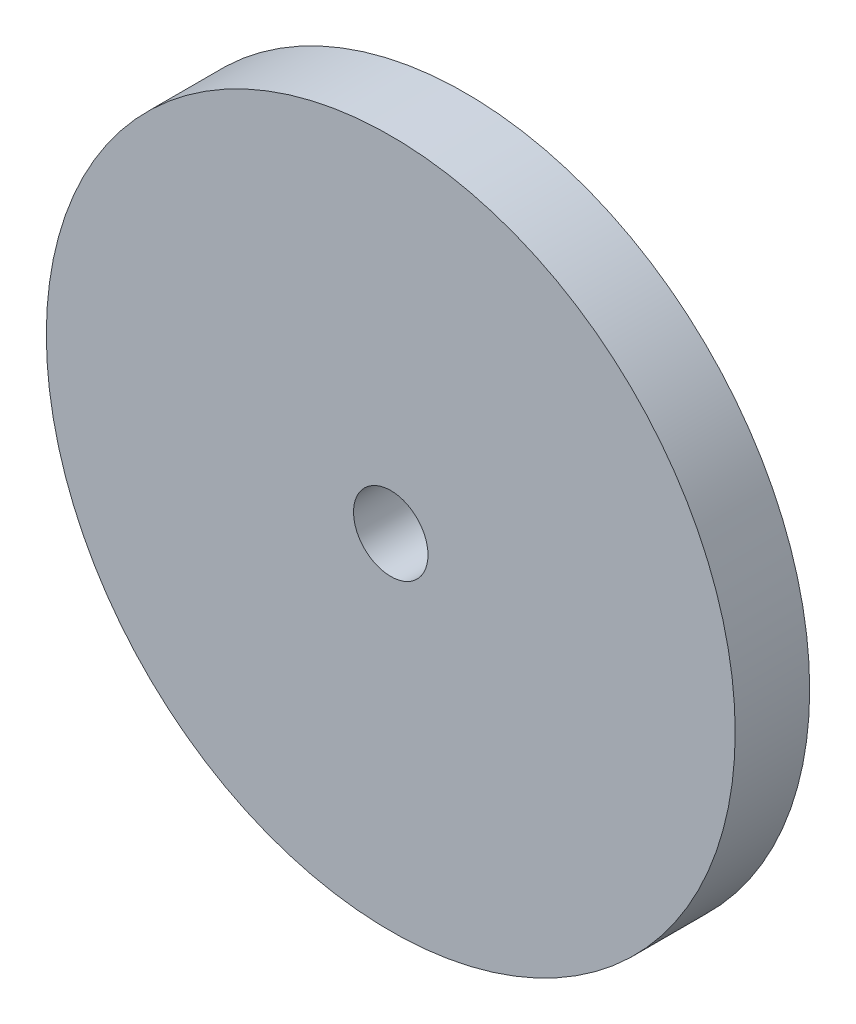
ISO-10303-21;
HEADER;
FILE_DESCRIPTION(('STEP AP214'),'2;1');
FILE_NAME('part.step','',(''),(''),'','','');
FILE_SCHEMA(('AUTOMOTIVE_DESIGN { 1 0 10303 214 1 1 1 1 }'));
ENDSEC;
DATA;
#1=APPLICATION_CONTEXT('core data for automotive mechanical design processes');
#2=APPLICATION_PROTOCOL_DEFINITION('international standard','automotive_design',2000,#1);
#3=PRODUCT_CONTEXT('',#1,'mechanical');
#4=PRODUCT('Part','Part','',(#3));
#5=PRODUCT_RELATED_PRODUCT_CATEGORY('part','',(#4));
#6=PRODUCT_DEFINITION_FORMATION('','',#4);
#7=PRODUCT_DEFINITION_CONTEXT('part definition',#1,'design');
#8=PRODUCT_DEFINITION('design','',#6,#7);
#9=PRODUCT_DEFINITION_SHAPE('','',#8);
#10=(LENGTH_UNIT() NAMED_UNIT(*) SI_UNIT(.MILLI.,.METRE.));
#11=(NAMED_UNIT(*) PLANE_ANGLE_UNIT() SI_UNIT($,.RADIAN.));
#12=(NAMED_UNIT(*) SI_UNIT($,.STERADIAN.) SOLID_ANGLE_UNIT());
#13=UNCERTAINTY_MEASURE_WITH_UNIT(LENGTH_MEASURE(1.E-05),#10,'distance_accuracy_value','');
#14=(GEOMETRIC_REPRESENTATION_CONTEXT(3) GLOBAL_UNCERTAINTY_ASSIGNED_CONTEXT((#13)) GLOBAL_UNIT_ASSIGNED_CONTEXT((#10,
#11,#12)) REPRESENTATION_CONTEXT('',''));
#15=CARTESIAN_POINT('',(0.,0.,0.));
#16=DIRECTION('',(0.,0.,1.));
#17=DIRECTION('',(1.,0.,0.));
#18=AXIS2_PLACEMENT_3D('',#15,#16,#17);
#19=CARTESIAN_POINT('',(0.,0.,4.));
#20=DIRECTION('',(0.,0.,-1.));
#21=DIRECTION('',(-1.,0.,0.));
#22=AXIS2_PLACEMENT_3D('',#19,#20,#21);
#23=CYLINDRICAL_SURFACE('',#22,18.5);
#24=CARTESIAN_POINT('',(0.,0.,4.));
#25=DIRECTION('',(0.,0.,1.));
#26=DIRECTION('',(1.,0.,0.));
#27=AXIS2_PLACEMENT_3D('',#24,#25,#26);
#28=CIRCLE('',#27,18.5);
#29=CARTESIAN_POINT('',(18.5,0.,4.));
#30=VERTEX_POINT('',#29);
#31=EDGE_CURVE('E10',#30,#30,#28,.T.);
#32=ORIENTED_EDGE('',*,*,#31,.F.);
#33=EDGE_LOOP('',(#32));
#34=FACE_BOUND('',#33,.T.);
#35=CARTESIAN_POINT('',(0.,0.,0.));
#36=DIRECTION('',(0.,0.,1.));
#37=DIRECTION('',(1.,0.,0.));
#38=AXIS2_PLACEMENT_3D('',#35,#36,#37);
#39=CIRCLE('',#38,18.5);
#40=CARTESIAN_POINT('',(18.5,0.,0.));
#41=VERTEX_POINT('',#40);
#42=EDGE_CURVE('E46',#41,#41,#39,.T.);
#43=ORIENTED_EDGE('',*,*,#42,.T.);
#44=EDGE_LOOP('',(#43));
#45=FACE_BOUND('',#44,.T.);
#46=ADVANCED_FACE('F43',(#34,#45),#23,.T.);
#47=CARTESIAN_POINT('',(0.,0.,4.));
#48=DIRECTION('',(0.,0.,1.));
#49=DIRECTION('',(1.,0.,0.));
#50=AXIS2_PLACEMENT_3D('',#47,#48,#49);
#51=PLANE('',#50);
#52=CARTESIAN_POINT('',(0.,0.,4.));
#53=DIRECTION('',(0.,0.,1.));
#54=DIRECTION('',(1.,0.,0.));
#55=AXIS2_PLACEMENT_3D('',#52,#53,#54);
#56=CIRCLE('',#55,2.);
#57=CARTESIAN_POINT('',(2.,0.,4.));
#58=VERTEX_POINT('',#57);
#59=EDGE_CURVE('E57',#58,#58,#56,.T.);
#60=ORIENTED_EDGE('',*,*,#59,.F.);
#61=EDGE_LOOP('',(#60));
#62=FACE_BOUND('',#61,.T.);
#63=ORIENTED_EDGE('',*,*,#31,.T.);
#64=EDGE_LOOP('',(#63));
#65=FACE_BOUND('',#64,.T.);
#66=ADVANCED_FACE('F63',(#62,#65),#51,.T.);
#67=CARTESIAN_POINT('',(0.,0.,0.));
#68=DIRECTION('',(0.,0.,1.));
#69=DIRECTION('',(1.,0.,0.));
#70=AXIS2_PLACEMENT_3D('',#67,#68,#69);
#71=PLANE('',#70);
#72=CARTESIAN_POINT('',(0.,0.,0.));
#73=DIRECTION('',(0.,0.,1.));
#74=DIRECTION('',(1.,0.,0.));
#75=AXIS2_PLACEMENT_3D('',#72,#73,#74);
#76=CIRCLE('',#75,2.);
#77=CARTESIAN_POINT('',(2.,0.,0.));
#78=VERTEX_POINT('',#77);
#79=EDGE_CURVE('E53',#78,#78,#76,.F.);
#80=ORIENTED_EDGE('',*,*,#79,.F.);
#81=EDGE_LOOP('',(#80));
#82=FACE_BOUND('',#81,.T.);
#83=ORIENTED_EDGE('',*,*,#42,.F.);
#84=EDGE_LOOP('',(#83));
#85=FACE_BOUND('',#84,.T.);
#86=ADVANCED_FACE('F65',(#82,#85),#71,.F.);
#87=CARTESIAN_POINT('',(0.,0.,-5.65685424949238));
#88=DIRECTION('',(0.,0.,1.));
#89=DIRECTION('',(1.,0.,0.));
#90=AXIS2_PLACEMENT_3D('',#87,#88,#89);
#91=CYLINDRICAL_SURFACE('',#90,2.);
#92=CARTESIAN_POINT('',(2.,0.,0.));
#93=CARTESIAN_POINT('',(2.,0.,0.0416666666666658));
#94=CARTESIAN_POINT('',(2.,0.,0.0833333333333325));
#95=CARTESIAN_POINT('',(2.,0.,0.166666666666666));
#96=CARTESIAN_POINT('',(2.,0.,0.208333333333333));
#97=CARTESIAN_POINT('',(2.,0.,0.291666666666666));
#98=CARTESIAN_POINT('',(2.,0.,0.333333333333333));
#99=CARTESIAN_POINT('',(2.,0.,0.416666666666666));
#100=CARTESIAN_POINT('',(2.,0.,0.458333333333333));
#101=CARTESIAN_POINT('',(2.,0.,0.541666666666666));
#102=CARTESIAN_POINT('',(2.,0.,0.583333333333332));
#103=CARTESIAN_POINT('',(2.,0.,0.666666666666666));
#104=CARTESIAN_POINT('',(2.,0.,0.708333333333332));
#105=CARTESIAN_POINT('',(2.,0.,0.791666666666666));
#106=CARTESIAN_POINT('',(2.,0.,0.833333333333332));
#107=CARTESIAN_POINT('',(2.,0.,0.916666666666666));
#108=CARTESIAN_POINT('',(2.,0.,0.958333333333332));
#109=CARTESIAN_POINT('',(2.,0.,1.04166666666667));
#110=CARTESIAN_POINT('',(2.,0.,1.08333333333333));
#111=CARTESIAN_POINT('',(2.,0.,1.16666666666667));
#112=CARTESIAN_POINT('',(2.,0.,1.20833333333333));
#113=CARTESIAN_POINT('',(2.,0.,1.29166666666667));
#114=CARTESIAN_POINT('',(2.,0.,1.33333333333333));
#115=CARTESIAN_POINT('',(2.,0.,1.41666666666667));
#116=CARTESIAN_POINT('',(2.,0.,1.45833333333333));
#117=CARTESIAN_POINT('',(2.,0.,1.54166666666667));
#118=CARTESIAN_POINT('',(2.,0.,1.58333333333333));
#119=CARTESIAN_POINT('',(2.,0.,1.66666666666667));
#120=CARTESIAN_POINT('',(2.,0.,1.70833333333333));
#121=CARTESIAN_POINT('',(2.,0.,1.79166666666667));
#122=CARTESIAN_POINT('',(2.,0.,1.83333333333333));
#123=CARTESIAN_POINT('',(2.,0.,1.91666666666667));
#124=CARTESIAN_POINT('',(2.,0.,1.95833333333333));
#125=CARTESIAN_POINT('',(2.,0.,2.04166666666667));
#126=CARTESIAN_POINT('',(2.,0.,2.08333333333333));
#127=CARTESIAN_POINT('',(2.,0.,2.16666666666667));
#128=CARTESIAN_POINT('',(2.,0.,2.20833333333333));
#129=CARTESIAN_POINT('',(2.,0.,2.29166666666667));
#130=CARTESIAN_POINT('',(2.,0.,2.33333333333333));
#131=CARTESIAN_POINT('',(2.,0.,2.41666666666667));
#132=CARTESIAN_POINT('',(2.,0.,2.45833333333333));
#133=CARTESIAN_POINT('',(2.,0.,2.54166666666667));
#134=CARTESIAN_POINT('',(2.,0.,2.58333333333333));
#135=CARTESIAN_POINT('',(2.,0.,2.66666666666666));
#136=CARTESIAN_POINT('',(2.,0.,2.70833333333333));
#137=CARTESIAN_POINT('',(2.,0.,2.79166666666666));
#138=CARTESIAN_POINT('',(2.,0.,2.83333333333333));
#139=CARTESIAN_POINT('',(2.,0.,2.91666666666666));
#140=CARTESIAN_POINT('',(2.,0.,2.95833333333333));
#141=CARTESIAN_POINT('',(2.,0.,3.04166666666666));
#142=CARTESIAN_POINT('',(2.,0.,3.08333333333333));
#143=CARTESIAN_POINT('',(2.,0.,3.16666666666666));
#144=CARTESIAN_POINT('',(2.,0.,3.20833333333333));
#145=CARTESIAN_POINT('',(2.,0.,3.29166666666666));
#146=CARTESIAN_POINT('',(2.,0.,3.33333333333333));
#147=CARTESIAN_POINT('',(2.,0.,3.41666666666666));
#148=CARTESIAN_POINT('',(2.,0.,3.45833333333333));
#149=CARTESIAN_POINT('',(2.,0.,3.54166666666666));
#150=CARTESIAN_POINT('',(2.,0.,3.58333333333333));
#151=CARTESIAN_POINT('',(2.,0.,3.66666666666666));
#152=CARTESIAN_POINT('',(2.,0.,3.70833333333333));
#153=CARTESIAN_POINT('',(2.,0.,3.79166666666667));
#154=CARTESIAN_POINT('',(2.,0.,3.83333333333333));
#155=CARTESIAN_POINT('',(2.,0.,3.91666666666666));
#156=CARTESIAN_POINT('',(2.,0.,3.95833333333333));
#157=CARTESIAN_POINT('',(2.,0.,4.));
#158=B_SPLINE_CURVE_WITH_KNOTS('',3,(#92,#93,#94,#95,#96,#97,#98,#99,#100,#101,#102,#103,#104,
#105,#106,#107,#108,#109,#110,#111,#112,#113,#114,#115,#116,#117,#118,#119,#120,#121,#122,#123,
#124,#125,#126,#127,#128,#129,#130,#131,#132,#133,#134,#135,#136,#137,#138,#139,#140,#141,#142,
#143,#144,#145,#146,#147,#148,#149,#150,#151,#152,#153,#154,#155,#156,#157),.UNSPECIFIED.,.F.,
.F.,(4,2,2,2,2,2,2,2,2,2,2,2,2,2,2,2,2,2,2,2,2,2,2,2,2,2,2,2,2,2,2,2,4),(0.,0.125,0.25,0.375,
0.5,0.625,0.75,0.875,1.,1.125,1.25,1.375,1.5,1.625,1.75,1.875,2.,2.125,2.25,2.375,2.5,2.625,
2.75,2.875,3.,3.125,3.25,3.375,3.5,3.625,3.75,3.875,4.),.UNSPECIFIED.);
#159=EDGE_CURVE('BSEAM61',#78,#58,#158,.T.);
#160=ORIENTED_EDGE('',*,*,#79,.T.);
#161=ORIENTED_EDGE('',*,*,#59,.T.);
#162=ORIENTED_EDGE('',*,*,#159,.T.);
#163=ORIENTED_EDGE('',*,*,#159,.F.);
#164=EDGE_LOOP('',(#160,#162,#161,#163));
#165=FACE_BOUND('',#164,.T.);
#166=ADVANCED_FACE('F61',(#165),#91,.F.);
#167=CLOSED_SHELL('',(#46,#66,#86,#166));
#168=MANIFOLD_SOLID_BREP('B2',#167);
#169=ADVANCED_BREP_SHAPE_REPRESENTATION('',(#18,#168),#14);
#170=SHAPE_DEFINITION_REPRESENTATION(#9,#169);
ENDSEC;
END-ISO-10303-21;
